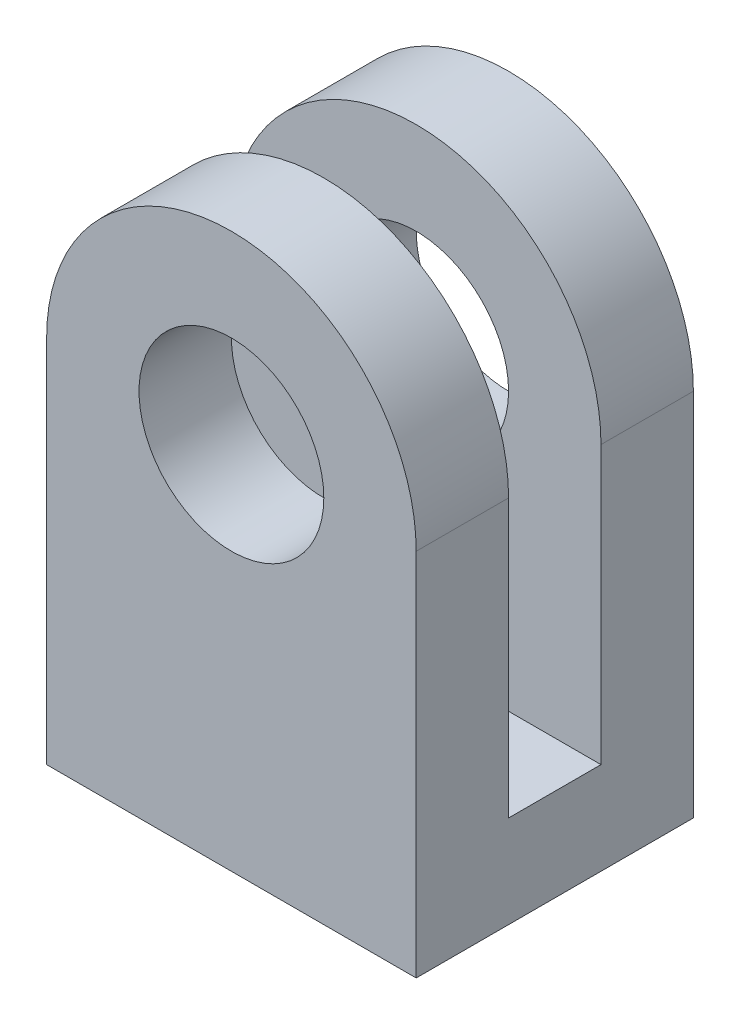
ISO-10303-21;
HEADER;
FILE_DESCRIPTION(('STEP AP214'),'2;1');
FILE_NAME('part.step','',(''),(''),'','','');
FILE_SCHEMA(('AUTOMOTIVE_DESIGN { 1 0 10303 214 1 1 1 1 }'));
ENDSEC;
DATA;
#1=APPLICATION_CONTEXT('core data for automotive mechanical design processes');
#2=APPLICATION_PROTOCOL_DEFINITION('international standard','automotive_design',2000,#1);
#3=PRODUCT_CONTEXT('',#1,'mechanical');
#4=PRODUCT('Part','Part','',(#3));
#5=PRODUCT_RELATED_PRODUCT_CATEGORY('part','',(#4));
#6=PRODUCT_DEFINITION_FORMATION('','',#4);
#7=PRODUCT_DEFINITION_CONTEXT('part definition',#1,'design');
#8=PRODUCT_DEFINITION('design','',#6,#7);
#9=PRODUCT_DEFINITION_SHAPE('','',#8);
#10=(LENGTH_UNIT() NAMED_UNIT(*) SI_UNIT(.MILLI.,.METRE.));
#11=(NAMED_UNIT(*) PLANE_ANGLE_UNIT() SI_UNIT($,.RADIAN.));
#12=(NAMED_UNIT(*) SI_UNIT($,.STERADIAN.) SOLID_ANGLE_UNIT());
#13=UNCERTAINTY_MEASURE_WITH_UNIT(LENGTH_MEASURE(1.E-05),#10,'distance_accuracy_value','');
#14=(GEOMETRIC_REPRESENTATION_CONTEXT(3) GLOBAL_UNCERTAINTY_ASSIGNED_CONTEXT((#13)) GLOBAL_UNIT_ASSIGNED_CONTEXT((#10,
#11,#12)) REPRESENTATION_CONTEXT('',''));
#15=CARTESIAN_POINT('',(0.,0.,0.));
#16=DIRECTION('',(0.,0.,1.));
#17=DIRECTION('',(1.,0.,0.));
#18=AXIS2_PLACEMENT_3D('',#15,#16,#17);
#19=CARTESIAN_POINT('',(0.,10.,15.));
#20=DIRECTION('',(0.,1.,0.));
#21=DIRECTION('',(0.,0.,1.));
#22=AXIS2_PLACEMENT_3D('',#19,#20,#21);
#23=PLANE('',#22);
#24=DIRECTION('',(1.,0.,0.));
#25=VECTOR('',#24,1.);
#26=CARTESIAN_POINT('',(0.,10.,20.));
#27=LINE('',#26,#25);
#28=CARTESIAN_POINT('',(0.,10.,20.));
#29=VERTEX_POINT('',#28);
#30=CARTESIAN_POINT('',(40.,10.,20.));
#31=VERTEX_POINT('',#30);
#32=EDGE_CURVE('E53',#29,#31,#27,.T.);
#33=ORIENTED_EDGE('',*,*,#32,.T.);
#34=DIRECTION('',(0.,0.,-1.));
#35=VECTOR('',#34,1.);
#36=CARTESIAN_POINT('',(40.,10.,15.));
#37=LINE('',#36,#35);
#38=CARTESIAN_POINT('',(40.,10.,10.));
#39=VERTEX_POINT('',#38);
#40=EDGE_CURVE('E160',#31,#39,#37,.T.);
#41=ORIENTED_EDGE('',*,*,#40,.T.);
#42=DIRECTION('',(1.,0.,0.));
#43=VECTOR('',#42,1.);
#44=CARTESIAN_POINT('',(0.,10.,10.));
#45=LINE('',#44,#43);
#46=CARTESIAN_POINT('',(0.,10.,10.));
#47=VERTEX_POINT('',#46);
#48=EDGE_CURVE('E147',#47,#39,#45,.T.);
#49=ORIENTED_EDGE('',*,*,#48,.F.);
#50=DIRECTION('',(0.,0.,-1.));
#51=VECTOR('',#50,1.);
#52=CARTESIAN_POINT('',(0.,10.,15.));
#53=LINE('',#52,#51);
#54=EDGE_CURVE('E11',#29,#47,#53,.T.);
#55=ORIENTED_EDGE('',*,*,#54,.F.);
#56=EDGE_LOOP('',(#33,#41,#49,#55));
#57=FACE_BOUND('',#56,.T.);
#58=ADVANCED_FACE('F35',(#57),#23,.T.);
#59=CARTESIAN_POINT('',(0.,0.,15.));
#60=DIRECTION('',(-1.,0.,0.));
#61=DIRECTION('',(0.,0.,1.));
#62=AXIS2_PLACEMENT_3D('',#59,#60,#61);
#63=PLANE('',#62);
#64=DIRECTION('',(0.,1.,0.));
#65=VECTOR('',#64,1.);
#66=CARTESIAN_POINT('',(0.,0.,0.));
#67=LINE('',#66,#65);
#68=CARTESIAN_POINT('',(0.,0.,0.));
#69=VERTEX_POINT('',#68);
#70=CARTESIAN_POINT('',(0.,40.,0.));
#71=VERTEX_POINT('',#70);
#72=EDGE_CURVE('E179',#69,#71,#67,.T.);
#73=ORIENTED_EDGE('',*,*,#72,.F.);
#74=DIRECTION('',(0.,0.,-1.));
#75=VECTOR('',#74,1.);
#76=CARTESIAN_POINT('',(0.,0.,15.));
#77=LINE('',#76,#75);
#78=CARTESIAN_POINT('',(0.,0.,30.));
#79=VERTEX_POINT('',#78);
#80=EDGE_CURVE('E43',#79,#69,#77,.T.);
#81=ORIENTED_EDGE('',*,*,#80,.F.);
#82=DIRECTION('',(0.,1.,0.));
#83=VECTOR('',#82,1.);
#84=CARTESIAN_POINT('',(0.,0.,30.));
#85=LINE('',#84,#83);
#86=CARTESIAN_POINT('',(0.,40.,30.));
#87=VERTEX_POINT('',#86);
#88=EDGE_CURVE('E109',#79,#87,#85,.T.);
#89=ORIENTED_EDGE('',*,*,#88,.T.);
#90=DIRECTION('',(0.,0.,1.));
#91=VECTOR('',#90,1.);
#92=CARTESIAN_POINT('',(0.,40.,20.));
#93=LINE('',#92,#91);
#94=CARTESIAN_POINT('',(0.,40.,20.));
#95=VERTEX_POINT('',#94);
#96=EDGE_CURVE('E105',#95,#87,#93,.T.);
#97=ORIENTED_EDGE('',*,*,#96,.F.);
#98=DIRECTION('',(0.,1.,0.));
#99=VECTOR('',#98,1.);
#100=CARTESIAN_POINT('',(0.,0.,20.));
#101=LINE('',#100,#99);
#102=EDGE_CURVE('E96',#29,#95,#101,.T.);
#103=ORIENTED_EDGE('',*,*,#102,.F.);
#104=ORIENTED_EDGE('',*,*,#54,.T.);
#105=DIRECTION('',(0.,1.,0.));
#106=VECTOR('',#105,1.);
#107=CARTESIAN_POINT('',(0.,0.,10.));
#108=LINE('',#107,#106);
#109=CARTESIAN_POINT('',(0.,40.,10.));
#110=VERTEX_POINT('',#109);
#111=EDGE_CURVE('E142',#47,#110,#108,.T.);
#112=ORIENTED_EDGE('',*,*,#111,.T.);
#113=DIRECTION('',(0.,0.,-1.));
#114=VECTOR('',#113,1.);
#115=CARTESIAN_POINT('',(0.,40.,10.));
#116=LINE('',#115,#114);
#117=EDGE_CURVE('E150',#110,#71,#116,.T.);
#118=ORIENTED_EDGE('',*,*,#117,.T.);
#119=EDGE_LOOP('',(#73,#81,#89,#97,#103,#104,#112,#118));
#120=FACE_BOUND('',#119,.T.);
#121=ADVANCED_FACE('F107',(#120),#63,.T.);
#122=CARTESIAN_POINT('',(0.,0.,15.));
#123=DIRECTION('',(0.,1.,0.));
#124=DIRECTION('',(0.,0.,1.));
#125=AXIS2_PLACEMENT_3D('',#122,#123,#124);
#126=PLANE('',#125);
#127=DIRECTION('',(1.,0.,0.));
#128=VECTOR('',#127,1.);
#129=CARTESIAN_POINT('',(0.,0.,0.));
#130=LINE('',#129,#128);
#131=CARTESIAN_POINT('',(40.,0.,0.));
#132=VERTEX_POINT('',#131);
#133=EDGE_CURVE('E173',#69,#132,#130,.T.);
#134=ORIENTED_EDGE('',*,*,#133,.T.);
#135=DIRECTION('',(0.,0.,-1.));
#136=VECTOR('',#135,1.);
#137=CARTESIAN_POINT('',(40.,0.,15.));
#138=LINE('',#137,#136);
#139=CARTESIAN_POINT('',(40.,0.,30.));
#140=VERTEX_POINT('',#139);
#141=EDGE_CURVE('E162',#140,#132,#138,.T.);
#142=ORIENTED_EDGE('',*,*,#141,.F.);
#143=DIRECTION('',(1.,0.,0.));
#144=VECTOR('',#143,1.);
#145=CARTESIAN_POINT('',(0.,0.,30.));
#146=LINE('',#145,#144);
#147=EDGE_CURVE('E130',#79,#140,#146,.T.);
#148=ORIENTED_EDGE('',*,*,#147,.F.);
#149=ORIENTED_EDGE('',*,*,#80,.T.);
#150=EDGE_LOOP('',(#134,#142,#148,#149));
#151=FACE_BOUND('',#150,.T.);
#152=ADVANCED_FACE('F172',(#151),#126,.F.);
#153=CARTESIAN_POINT('',(40.,0.,15.));
#154=DIRECTION('',(-1.,0.,0.));
#155=DIRECTION('',(0.,0.,1.));
#156=AXIS2_PLACEMENT_3D('',#153,#154,#155);
#157=PLANE('',#156);
#158=DIRECTION('',(0.,1.,0.));
#159=VECTOR('',#158,1.);
#160=CARTESIAN_POINT('',(40.,0.,0.));
#161=LINE('',#160,#159);
#162=CARTESIAN_POINT('',(40.,40.,0.));
#163=VERTEX_POINT('',#162);
#164=EDGE_CURVE('E163',#132,#163,#161,.T.);
#165=ORIENTED_EDGE('',*,*,#164,.T.);
#166=DIRECTION('',(0.,0.,-1.));
#167=VECTOR('',#166,1.);
#168=CARTESIAN_POINT('',(40.,40.,10.));
#169=LINE('',#168,#167);
#170=CARTESIAN_POINT('',(40.,40.,10.));
#171=VERTEX_POINT('',#170);
#172=EDGE_CURVE('E183',#171,#163,#169,.T.);
#173=ORIENTED_EDGE('',*,*,#172,.F.);
#174=DIRECTION('',(0.,1.,0.));
#175=VECTOR('',#174,1.);
#176=CARTESIAN_POINT('',(40.,0.,10.));
#177=LINE('',#176,#175);
#178=EDGE_CURVE('E138',#39,#171,#177,.T.);
#179=ORIENTED_EDGE('',*,*,#178,.F.);
#180=ORIENTED_EDGE('',*,*,#40,.F.);
#181=DIRECTION('',(0.,1.,0.));
#182=VECTOR('',#181,1.);
#183=CARTESIAN_POINT('',(40.,0.,20.));
#184=LINE('',#183,#182);
#185=CARTESIAN_POINT('',(40.,40.,20.));
#186=VERTEX_POINT('',#185);
#187=EDGE_CURVE('E305',#31,#186,#184,.T.);
#188=ORIENTED_EDGE('',*,*,#187,.T.);
#189=DIRECTION('',(0.,0.,1.));
#190=VECTOR('',#189,1.);
#191=CARTESIAN_POINT('',(40.,40.,20.));
#192=LINE('',#191,#190);
#193=CARTESIAN_POINT('',(40.,40.,30.));
#194=VERTEX_POINT('',#193);
#195=EDGE_CURVE('E114',#186,#194,#192,.T.);
#196=ORIENTED_EDGE('',*,*,#195,.T.);
#197=DIRECTION('',(0.,1.,0.));
#198=VECTOR('',#197,1.);
#199=CARTESIAN_POINT('',(40.,0.,30.));
#200=LINE('',#199,#198);
#201=EDGE_CURVE('E113',#140,#194,#200,.T.);
#202=ORIENTED_EDGE('',*,*,#201,.F.);
#203=ORIENTED_EDGE('',*,*,#141,.T.);
#204=EDGE_LOOP('',(#165,#173,#179,#180,#188,#196,#202,#203));
#205=FACE_BOUND('',#204,.T.);
#206=ADVANCED_FACE('F214',(#205),#157,.F.);
#207=CARTESIAN_POINT('',(0.,0.,0.));
#208=DIRECTION('',(0.,0.,1.));
#209=DIRECTION('',(1.,0.,0.));
#210=AXIS2_PLACEMENT_3D('',#207,#208,#209);
#211=PLANE('',#210);
#212=ORIENTED_EDGE('',*,*,#72,.T.);
#213=CARTESIAN_POINT('',(20.,40.,0.));
#214=DIRECTION('',(0.,0.,1.));
#215=DIRECTION('',(1.,0.,0.));
#216=AXIS2_PLACEMENT_3D('',#213,#214,#215);
#217=CIRCLE('',#216,20.);
#218=EDGE_CURVE('E139',#163,#71,#217,.T.);
#219=ORIENTED_EDGE('',*,*,#218,.F.);
#220=ORIENTED_EDGE('',*,*,#164,.F.);
#221=ORIENTED_EDGE('',*,*,#133,.F.);
#222=EDGE_LOOP('',(#212,#219,#220,#221));
#223=FACE_BOUND('',#222,.T.);
#224=CARTESIAN_POINT('',(20.,40.,0.));
#225=DIRECTION('',(0.,0.,1.));
#226=DIRECTION('',(1.,0.,0.));
#227=AXIS2_PLACEMENT_3D('',#224,#225,#226);
#228=CIRCLE('',#227,10.);
#229=CARTESIAN_POINT('',(30.,40.,0.));
#230=VERTEX_POINT('',#229);
#231=EDGE_CURVE('E134',#230,#230,#228,.T.);
#232=ORIENTED_EDGE('',*,*,#231,.T.);
#233=EDGE_LOOP('',(#232));
#234=FACE_BOUND('',#233,.T.);
#235=ADVANCED_FACE('F176',(#223,#234),#211,.F.);
#236=CARTESIAN_POINT('',(20.,40.,10.));
#237=DIRECTION('',(0.,0.,-1.));
#238=DIRECTION('',(-1.,0.,0.));
#239=AXIS2_PLACEMENT_3D('',#236,#237,#238);
#240=CYLINDRICAL_SURFACE('',#239,20.);
#241=ORIENTED_EDGE('',*,*,#218,.T.);
#242=ORIENTED_EDGE('',*,*,#117,.F.);
#243=CARTESIAN_POINT('',(20.,40.,10.));
#244=DIRECTION('',(0.,0.,1.));
#245=DIRECTION('',(1.,0.,0.));
#246=AXIS2_PLACEMENT_3D('',#243,#244,#245);
#247=CIRCLE('',#246,20.);
#248=EDGE_CURVE('E140',#171,#110,#247,.T.);
#249=ORIENTED_EDGE('',*,*,#248,.F.);
#250=ORIENTED_EDGE('',*,*,#172,.T.);
#251=EDGE_LOOP('',(#241,#242,#249,#250));
#252=FACE_BOUND('',#251,.T.);
#253=ADVANCED_FACE('F195',(#252),#240,.T.);
#254=CARTESIAN_POINT('',(20.,40.,10.));
#255=DIRECTION('',(0.,0.,-1.));
#256=DIRECTION('',(-1.,0.,0.));
#257=AXIS2_PLACEMENT_3D('',#254,#255,#256);
#258=CYLINDRICAL_SURFACE('',#257,10.);
#259=CARTESIAN_POINT('',(20.,40.,10.));
#260=DIRECTION('',(0.,0.,1.));
#261=DIRECTION('',(1.,0.,0.));
#262=AXIS2_PLACEMENT_3D('',#259,#260,#261);
#263=CIRCLE('',#262,10.);
#264=CARTESIAN_POINT('',(30.,40.,10.));
#265=VERTEX_POINT('',#264);
#266=EDGE_CURVE('E135',#265,#265,#263,.T.);
#267=ORIENTED_EDGE('',*,*,#266,.T.);
#268=EDGE_LOOP('',(#267));
#269=FACE_BOUND('',#268,.T.);
#270=ORIENTED_EDGE('',*,*,#231,.F.);
#271=EDGE_LOOP('',(#270));
#272=FACE_BOUND('',#271,.T.);
#273=ADVANCED_FACE('F192',(#269,#272),#258,.F.);
#274=CARTESIAN_POINT('',(0.,0.,10.));
#275=DIRECTION('',(0.,0.,1.));
#276=DIRECTION('',(1.,0.,0.));
#277=AXIS2_PLACEMENT_3D('',#274,#275,#276);
#278=PLANE('',#277);
#279=ORIENTED_EDGE('',*,*,#266,.F.);
#280=EDGE_LOOP('',(#279));
#281=FACE_BOUND('',#280,.T.);
#282=ORIENTED_EDGE('',*,*,#178,.T.);
#283=ORIENTED_EDGE('',*,*,#248,.T.);
#284=ORIENTED_EDGE('',*,*,#111,.F.);
#285=ORIENTED_EDGE('',*,*,#48,.T.);
#286=EDGE_LOOP('',(#282,#283,#284,#285));
#287=FACE_BOUND('',#286,.T.);
#288=ADVANCED_FACE('F194',(#281,#287),#278,.T.);
#289=CARTESIAN_POINT('',(0.,0.,30.));
#290=DIRECTION('',(0.,0.,-1.));
#291=DIRECTION('',(1.,0.,0.));
#292=AXIS2_PLACEMENT_3D('',#289,#290,#291);
#293=PLANE('',#292);
#294=ORIENTED_EDGE('',*,*,#201,.T.);
#295=CARTESIAN_POINT('',(20.,40.,30.));
#296=DIRECTION('',(0.,0.,1.));
#297=DIRECTION('',(1.,0.,0.));
#298=AXIS2_PLACEMENT_3D('',#295,#296,#297);
#299=CIRCLE('',#298,20.);
#300=EDGE_CURVE('E126',#194,#87,#299,.T.);
#301=ORIENTED_EDGE('',*,*,#300,.T.);
#302=ORIENTED_EDGE('',*,*,#88,.F.);
#303=ORIENTED_EDGE('',*,*,#147,.T.);
#304=EDGE_LOOP('',(#294,#301,#302,#303));
#305=FACE_BOUND('',#304,.T.);
#306=CARTESIAN_POINT('',(20.,40.,30.));
#307=DIRECTION('',(0.,0.,1.));
#308=DIRECTION('',(1.,0.,0.));
#309=AXIS2_PLACEMENT_3D('',#306,#307,#308);
#310=CIRCLE('',#309,10.);
#311=CARTESIAN_POINT('',(30.,40.,30.));
#312=VERTEX_POINT('',#311);
#313=EDGE_CURVE('E123',#312,#312,#310,.T.);
#314=ORIENTED_EDGE('',*,*,#313,.F.);
#315=EDGE_LOOP('',(#314));
#316=FACE_BOUND('',#315,.T.);
#317=ADVANCED_FACE('F202',(#305,#316),#293,.F.);
#318=CARTESIAN_POINT('',(20.,40.,20.));
#319=DIRECTION('',(0.,0.,1.));
#320=DIRECTION('',(1.,0.,0.));
#321=AXIS2_PLACEMENT_3D('',#318,#319,#320);
#322=CYLINDRICAL_SURFACE('',#321,10.);
#323=CARTESIAN_POINT('',(20.,40.,20.));
#324=DIRECTION('',(0.,0.,1.));
#325=DIRECTION('',(1.,0.,0.));
#326=AXIS2_PLACEMENT_3D('',#323,#324,#325);
#327=CIRCLE('',#326,10.);
#328=CARTESIAN_POINT('',(30.,40.,20.));
#329=VERTEX_POINT('',#328);
#330=EDGE_CURVE('E127',#329,#329,#327,.T.);
#331=ORIENTED_EDGE('',*,*,#330,.F.);
#332=EDGE_LOOP('',(#331));
#333=FACE_BOUND('',#332,.T.);
#334=ORIENTED_EDGE('',*,*,#313,.T.);
#335=EDGE_LOOP('',(#334));
#336=FACE_BOUND('',#335,.T.);
#337=ADVANCED_FACE('F272',(#333,#336),#322,.F.);
#338=CARTESIAN_POINT('',(20.,40.,20.));
#339=DIRECTION('',(0.,0.,1.));
#340=DIRECTION('',(1.,0.,0.));
#341=AXIS2_PLACEMENT_3D('',#338,#339,#340);
#342=CYLINDRICAL_SURFACE('',#341,20.);
#343=ORIENTED_EDGE('',*,*,#300,.F.);
#344=ORIENTED_EDGE('',*,*,#195,.F.);
#345=CARTESIAN_POINT('',(20.,40.,20.));
#346=DIRECTION('',(0.,0.,1.));
#347=DIRECTION('',(1.,0.,0.));
#348=AXIS2_PLACEMENT_3D('',#345,#346,#347);
#349=CIRCLE('',#348,20.);
#350=EDGE_CURVE('E101',#186,#95,#349,.T.);
#351=ORIENTED_EDGE('',*,*,#350,.T.);
#352=ORIENTED_EDGE('',*,*,#96,.T.);
#353=EDGE_LOOP('',(#343,#344,#351,#352));
#354=FACE_BOUND('',#353,.T.);
#355=ADVANCED_FACE('F116',(#354),#342,.T.);
#356=CARTESIAN_POINT('',(0.,0.,20.));
#357=DIRECTION('',(0.,0.,-1.));
#358=DIRECTION('',(1.,0.,0.));
#359=AXIS2_PLACEMENT_3D('',#356,#357,#358);
#360=PLANE('',#359);
#361=ORIENTED_EDGE('',*,*,#330,.T.);
#362=EDGE_LOOP('',(#361));
#363=FACE_BOUND('',#362,.T.);
#364=ORIENTED_EDGE('',*,*,#187,.F.);
#365=ORIENTED_EDGE('',*,*,#32,.F.);
#366=ORIENTED_EDGE('',*,*,#102,.T.);
#367=ORIENTED_EDGE('',*,*,#350,.F.);
#368=EDGE_LOOP('',(#364,#365,#366,#367));
#369=FACE_BOUND('',#368,.T.);
#370=ADVANCED_FACE('F99',(#363,#369),#360,.T.);
#371=CLOSED_SHELL('',(#58,#121,#152,#206,#235,#253,#273,#288,#317,#337,#355,#370));
#372=MANIFOLD_SOLID_BREP('B2',#371);
#373=ADVANCED_BREP_SHAPE_REPRESENTATION('',(#18,#372),#14);
#374=SHAPE_DEFINITION_REPRESENTATION(#9,#373);
ENDSEC;
END-ISO-10303-21;
